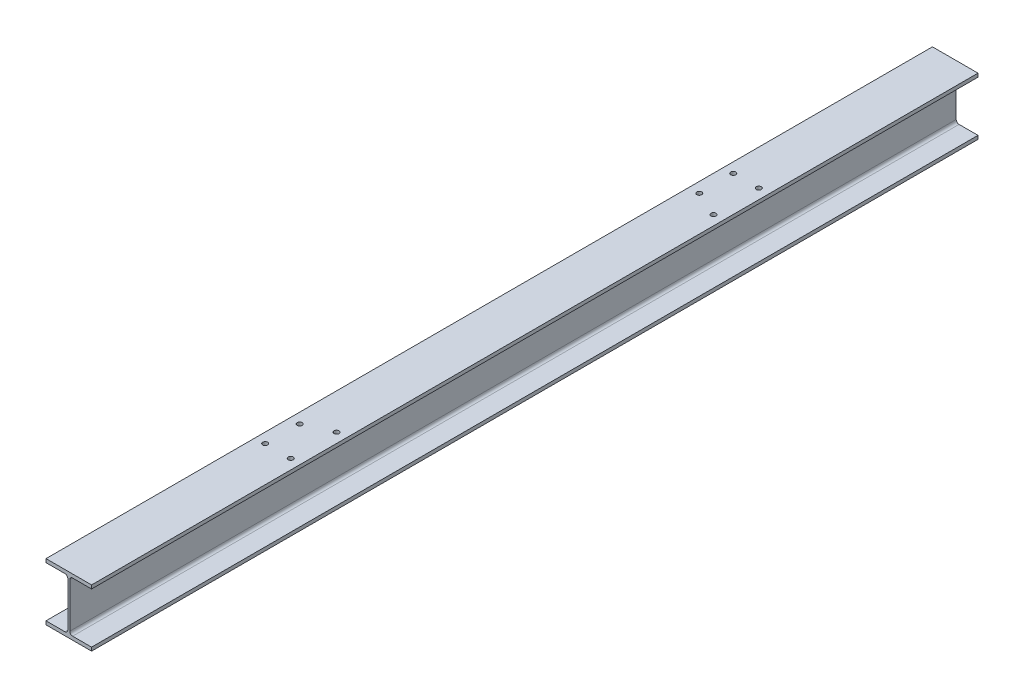
ISO-10303-21;
HEADER;
FILE_DESCRIPTION(('STEP AP214'),'2;1');
FILE_NAME('part.step','',(''),(''),'','','');
FILE_SCHEMA(('AUTOMOTIVE_DESIGN { 1 0 10303 214 1 1 1 1 }'));
ENDSEC;
DATA;
#1=APPLICATION_CONTEXT('core data for automotive mechanical design processes');
#2=APPLICATION_PROTOCOL_DEFINITION('international standard','automotive_design',2000,#1);
#3=PRODUCT_CONTEXT('',#1,'mechanical');
#4=PRODUCT('Part','Part','',(#3));
#5=PRODUCT_RELATED_PRODUCT_CATEGORY('part','',(#4));
#6=PRODUCT_DEFINITION_FORMATION('','',#4);
#7=PRODUCT_DEFINITION_CONTEXT('part definition',#1,'design');
#8=PRODUCT_DEFINITION('design','',#6,#7);
#9=PRODUCT_DEFINITION_SHAPE('','',#8);
#10=(LENGTH_UNIT() NAMED_UNIT(*) SI_UNIT(.MILLI.,.METRE.));
#11=(NAMED_UNIT(*) PLANE_ANGLE_UNIT() SI_UNIT($,.RADIAN.));
#12=(NAMED_UNIT(*) SI_UNIT($,.STERADIAN.) SOLID_ANGLE_UNIT());
#13=UNCERTAINTY_MEASURE_WITH_UNIT(LENGTH_MEASURE(1.E-05),#10,'distance_accuracy_value','');
#14=(GEOMETRIC_REPRESENTATION_CONTEXT(3) GLOBAL_UNCERTAINTY_ASSIGNED_CONTEXT((#13)) GLOBAL_UNIT_ASSIGNED_CONTEXT((#10,
#11,#12)) REPRESENTATION_CONTEXT('',''));
#15=CARTESIAN_POINT('',(0.,0.,0.));
#16=DIRECTION('',(0.,0.,1.));
#17=DIRECTION('',(1.,0.,0.));
#18=AXIS2_PLACEMENT_3D('',#15,#16,#17);
#19=CARTESIAN_POINT('',(183.500636302133,10.8236048524095,-1977.89024698075));
#20=DIRECTION('',(0.,-1.,0.));
#21=DIRECTION('',(0.,0.,-1.));
#22=AXIS2_PLACEMENT_3D('',#19,#20,#21);
#23=PLANE('',#22);
#24=DIRECTION('',(1.,0.,0.));
#25=VECTOR('',#24,1.);
#26=CARTESIAN_POINT('',(183.500636302133,10.8236048524095,1984.50975301925));
#27=LINE('',#26,#25);
#28=CARTESIAN_POINT('',(-20.207363697867,10.8236048524095,1984.50975301925));
#29=VERTEX_POINT('',#28);
#30=CARTESIAN_POINT('',(183.500636302133,10.8236048524095,1984.50975301925));
#31=VERTEX_POINT('',#30);
#32=EDGE_CURVE('E187',#29,#31,#27,.T.);
#33=ORIENTED_EDGE('',*,*,#32,.F.);
#34=DIRECTION('',(0.,0.,1.));
#35=VECTOR('',#34,1.);
#36=CARTESIAN_POINT('',(-20.207363697867,10.8236048524095,-1977.89024698075));
#37=LINE('',#36,#35);
#38=CARTESIAN_POINT('',(-20.207363697867,10.8236048524095,-1977.89024698075));
#39=VERTEX_POINT('',#38);
#40=EDGE_CURVE('E11',#39,#29,#37,.T.);
#41=ORIENTED_EDGE('',*,*,#40,.F.);
#42=DIRECTION('',(1.,0.,0.));
#43=VECTOR('',#42,1.);
#44=CARTESIAN_POINT('',(183.500636302133,10.8236048524095,-1977.89024698075));
#45=LINE('',#44,#43);
#46=CARTESIAN_POINT('',(183.500636302133,10.8236048524095,-1977.89024698075));
#47=VERTEX_POINT('',#46);
#48=EDGE_CURVE('E233',#39,#47,#45,.T.);
#49=ORIENTED_EDGE('',*,*,#48,.T.);
#50=DIRECTION('',(0.,0.,1.));
#51=VECTOR('',#50,1.);
#52=CARTESIAN_POINT('',(183.500636302133,10.8236048524095,-1977.89024698075));
#53=LINE('',#52,#51);
#54=EDGE_CURVE('E43',#47,#31,#53,.T.);
#55=ORIENTED_EDGE('',*,*,#54,.T.);
#56=EDGE_LOOP('',(#33,#41,#49,#55));
#57=FACE_BOUND('',#56,.T.);
#58=ADVANCED_FACE('F40',(#57),#23,.T.);
#59=CARTESIAN_POINT('',(-20.207363697867,10.8236048524095,-1977.89024698075));
#60=DIRECTION('',(-1.,0.,0.));
#61=DIRECTION('',(0.,-1.,0.));
#62=AXIS2_PLACEMENT_3D('',#59,#60,#61);
#63=PLANE('',#62);
#64=DIRECTION('',(0.,-1.,0.));
#65=VECTOR('',#64,1.);
#66=CARTESIAN_POINT('',(-20.207363697867,10.8236048524095,1984.50975301925));
#67=LINE('',#66,#65);
#68=CARTESIAN_POINT('',(-20.207363697867,26.5716048524095,1984.50975301925));
#69=VERTEX_POINT('',#68);
#70=EDGE_CURVE('E231',#69,#29,#67,.T.);
#71=ORIENTED_EDGE('',*,*,#70,.F.);
#72=DIRECTION('',(0.,0.,1.));
#73=VECTOR('',#72,1.);
#74=CARTESIAN_POINT('',(-20.207363697867,26.5716048524095,-1977.89024698075));
#75=LINE('',#74,#73);
#76=CARTESIAN_POINT('',(-20.207363697867,26.5716048524095,-1977.89024698075));
#77=VERTEX_POINT('',#76);
#78=EDGE_CURVE('E50',#77,#69,#75,.T.);
#79=ORIENTED_EDGE('',*,*,#78,.F.);
#80=DIRECTION('',(0.,-1.,0.));
#81=VECTOR('',#80,1.);
#82=CARTESIAN_POINT('',(-20.207363697867,10.8236048524095,-1977.89024698075));
#83=LINE('',#82,#81);
#84=EDGE_CURVE('E177',#77,#39,#83,.T.);
#85=ORIENTED_EDGE('',*,*,#84,.T.);
#86=ORIENTED_EDGE('',*,*,#40,.T.);
#87=EDGE_LOOP('',(#71,#79,#85,#86));
#88=FACE_BOUND('',#87,.T.);
#89=ADVANCED_FACE('F275',(#88),#63,.T.);
#90=CARTESIAN_POINT('',(-20.207363697867,26.5716048524095,-1977.89024698075));
#91=DIRECTION('',(0.,1.,0.));
#92=DIRECTION('',(-1.,0.,0.));
#93=AXIS2_PLACEMENT_3D('',#90,#91,#92);
#94=PLANE('',#93);
#95=DIRECTION('',(-1.,0.,0.));
#96=VECTOR('',#95,1.);
#97=CARTESIAN_POINT('',(-20.207363697867,26.5716048524095,1984.50975301925));
#98=LINE('',#97,#96);
#99=CARTESIAN_POINT('',(64.501636302133,26.5716048524095,1984.50975301925));
#100=VERTEX_POINT('',#99);
#101=EDGE_CURVE('E163',#100,#69,#98,.T.);
#102=ORIENTED_EDGE('',*,*,#101,.F.);
#103=DIRECTION('',(0.,0.,1.));
#104=VECTOR('',#103,1.);
#105=CARTESIAN_POINT('',(64.501636302133,26.5716048524095,-1977.89024698075));
#106=LINE('',#105,#104);
#107=CARTESIAN_POINT('',(64.501636302133,26.5716048524095,-1977.89024698075));
#108=VERTEX_POINT('',#107);
#109=EDGE_CURVE('E158',#108,#100,#106,.T.);
#110=ORIENTED_EDGE('',*,*,#109,.F.);
#111=DIRECTION('',(-1.,0.,0.));
#112=VECTOR('',#111,1.);
#113=CARTESIAN_POINT('',(-20.207363697867,26.5716048524095,-1977.89024698075));
#114=LINE('',#113,#112);
#115=EDGE_CURVE('E161',#108,#77,#114,.T.);
#116=ORIENTED_EDGE('',*,*,#115,.T.);
#117=ORIENTED_EDGE('',*,*,#78,.T.);
#118=EDGE_LOOP('',(#102,#110,#116,#117));
#119=FACE_BOUND('',#118,.T.);
#120=ADVANCED_FACE('F160',(#119),#94,.T.);
#121=CARTESIAN_POINT('',(64.501636302133,39.2716048524095,-1977.89024698075));
#122=DIRECTION('',(0.,0.,1.));
#123=DIRECTION('',(1.,0.,0.));
#124=AXIS2_PLACEMENT_3D('',#121,#122,#123);
#125=CYLINDRICAL_SURFACE('',#124,12.7);
#126=CARTESIAN_POINT('',(64.501636302133,39.2716048524095,1984.50975301925));
#127=DIRECTION('',(0.,0.,-1.));
#128=DIRECTION('',(1.,0.,0.));
#129=AXIS2_PLACEMENT_3D('',#126,#127,#128);
#130=CIRCLE('',#129,12.7);
#131=CARTESIAN_POINT('',(77.201636302133,39.2716048524095,1984.50975301925));
#132=VERTEX_POINT('',#131);
#133=EDGE_CURVE('E228',#132,#100,#130,.T.);
#134=ORIENTED_EDGE('',*,*,#133,.F.);
#135=DIRECTION('',(0.,0.,1.));
#136=VECTOR('',#135,1.);
#137=CARTESIAN_POINT('',(77.201636302133,39.2716048524095,-1977.89024698075));
#138=LINE('',#137,#136);
#139=CARTESIAN_POINT('',(77.201636302133,39.2716048524095,-1977.89024698075));
#140=VERTEX_POINT('',#139);
#141=EDGE_CURVE('E169',#140,#132,#138,.T.);
#142=ORIENTED_EDGE('',*,*,#141,.F.);
#143=CARTESIAN_POINT('',(64.501636302133,39.2716048524095,-1977.89024698075));
#144=DIRECTION('',(0.,0.,-1.));
#145=DIRECTION('',(1.,0.,0.));
#146=AXIS2_PLACEMENT_3D('',#143,#144,#145);
#147=CIRCLE('',#146,12.7);
#148=EDGE_CURVE('E175',#140,#108,#147,.T.);
#149=ORIENTED_EDGE('',*,*,#148,.T.);
#150=ORIENTED_EDGE('',*,*,#109,.T.);
#151=EDGE_LOOP('',(#134,#142,#149,#150));
#152=FACE_BOUND('',#151,.T.);
#153=ADVANCED_FACE('F179',(#152),#125,.F.);
#154=CARTESIAN_POINT('',(77.201636302133,39.2716048524095,-1977.89024698075));
#155=DIRECTION('',(-1.,0.,0.));
#156=DIRECTION('',(0.,-1.,0.));
#157=AXIS2_PLACEMENT_3D('',#154,#155,#156);
#158=PLANE('',#157);
#159=DIRECTION('',(0.,-1.,0.));
#160=VECTOR('',#159,1.);
#161=CARTESIAN_POINT('',(77.201636302133,39.2716048524095,1984.50975301925));
#162=LINE('',#161,#160);
#163=CARTESIAN_POINT('',(77.2016363021329,238.91560485241,1984.50975301925));
#164=VERTEX_POINT('',#163);
#165=EDGE_CURVE('E225',#164,#132,#162,.T.);
#166=ORIENTED_EDGE('',*,*,#165,.F.);
#167=DIRECTION('',(0.,0.,1.));
#168=VECTOR('',#167,1.);
#169=CARTESIAN_POINT('',(77.2016363021329,238.91560485241,-1977.89024698075));
#170=LINE('',#169,#168);
#171=CARTESIAN_POINT('',(77.2016363021329,238.91560485241,-1977.89024698075));
#172=VERTEX_POINT('',#171);
#173=EDGE_CURVE('E239',#172,#164,#170,.T.);
#174=ORIENTED_EDGE('',*,*,#173,.F.);
#175=DIRECTION('',(0.,-1.,0.));
#176=VECTOR('',#175,1.);
#177=CARTESIAN_POINT('',(77.201636302133,39.2716048524095,-1977.89024698075));
#178=LINE('',#177,#176);
#179=EDGE_CURVE('E180',#172,#140,#178,.T.);
#180=ORIENTED_EDGE('',*,*,#179,.T.);
#181=ORIENTED_EDGE('',*,*,#141,.T.);
#182=EDGE_LOOP('',(#166,#174,#180,#181));
#183=FACE_BOUND('',#182,.T.);
#184=ADVANCED_FACE('F288',(#183),#158,.T.);
#185=CARTESIAN_POINT('',(64.5016363021329,238.91560485241,-1977.89024698075));
#186=DIRECTION('',(0.,0.,1.));
#187=DIRECTION('',(1.,0.,0.));
#188=AXIS2_PLACEMENT_3D('',#185,#186,#187);
#189=CYLINDRICAL_SURFACE('',#188,12.7);
#190=CARTESIAN_POINT('',(64.5016363021329,238.91560485241,1984.50975301925));
#191=DIRECTION('',(0.,0.,-1.));
#192=DIRECTION('',(1.,0.,0.));
#193=AXIS2_PLACEMENT_3D('',#190,#191,#192);
#194=CIRCLE('',#193,12.7);
#195=CARTESIAN_POINT('',(64.5016363021329,251.61560485241,1984.50975301925));
#196=VERTEX_POINT('',#195);
#197=EDGE_CURVE('E222',#196,#164,#194,.T.);
#198=ORIENTED_EDGE('',*,*,#197,.F.);
#199=DIRECTION('',(0.,0.,1.));
#200=VECTOR('',#199,1.);
#201=CARTESIAN_POINT('',(64.5016363021329,251.61560485241,-1977.89024698075));
#202=LINE('',#201,#200);
#203=CARTESIAN_POINT('',(64.5016363021329,251.61560485241,-1977.89024698075));
#204=VERTEX_POINT('',#203);
#205=EDGE_CURVE('E242',#204,#196,#202,.T.);
#206=ORIENTED_EDGE('',*,*,#205,.F.);
#207=CARTESIAN_POINT('',(64.5016363021329,238.91560485241,-1977.89024698075));
#208=DIRECTION('',(0.,0.,-1.));
#209=DIRECTION('',(1.,0.,0.));
#210=AXIS2_PLACEMENT_3D('',#207,#208,#209);
#211=CIRCLE('',#210,12.7);
#212=EDGE_CURVE('E182',#204,#172,#211,.T.);
#213=ORIENTED_EDGE('',*,*,#212,.T.);
#214=ORIENTED_EDGE('',*,*,#173,.T.);
#215=EDGE_LOOP('',(#198,#206,#213,#214));
#216=FACE_BOUND('',#215,.T.);
#217=ADVANCED_FACE('F291',(#216),#189,.F.);
#218=CARTESIAN_POINT('',(64.5016363021329,251.61560485241,-1977.89024698075));
#219=DIRECTION('',(0.,-1.,0.));
#220=DIRECTION('',(0.,0.,-1.));
#221=AXIS2_PLACEMENT_3D('',#218,#219,#220);
#222=PLANE('',#221);
#223=CARTESIAN_POINT('',(24.4966363021329,251.61560485241,1049.4768369836));
#224=DIRECTION('',(0.,-1.,0.));
#225=DIRECTION('',(0.,0.,-1.));
#226=AXIS2_PLACEMENT_3D('',#223,#224,#225);
#227=CIRCLE('',#226,11.1124999999994);
#228=CARTESIAN_POINT('',(24.4966363021329,251.61560485241,1038.3643369836));
#229=VERTEX_POINT('',#228);
#230=EDGE_CURVE('E379',#229,#229,#227,.F.);
#231=ORIENTED_EDGE('',*,*,#230,.T.);
#232=EDGE_LOOP('',(#231));
#233=FACE_BOUND('',#232,.T.);
#234=CARTESIAN_POINT('',(25.7322612695542,251.61560485241,896.427245817367));
#235=DIRECTION('',(0.,-1.,0.));
#236=DIRECTION('',(0.,0.,-1.));
#237=AXIS2_PLACEMENT_3D('',#234,#235,#236);
#238=CIRCLE('',#237,11.1124999999994);
#239=CARTESIAN_POINT('',(25.7322612695542,251.61560485241,885.314745817368));
#240=VERTEX_POINT('',#239);
#241=EDGE_CURVE('E394',#240,#240,#238,.F.);
#242=ORIENTED_EDGE('',*,*,#241,.T.);
#243=EDGE_LOOP('',(#242));
#244=FACE_BOUND('',#243,.T.);
#245=CARTESIAN_POINT('',(25.7322612695542,251.61560485241,-889.807739778871));
#246=DIRECTION('',(0.,-1.,0.));
#247=DIRECTION('',(0.,0.,-1.));
#248=AXIS2_PLACEMENT_3D('',#245,#246,#247);
#249=CIRCLE('',#248,11.1124999999994);
#250=CARTESIAN_POINT('',(25.7322612695542,251.61560485241,-900.920239778871));
#251=VERTEX_POINT('',#250);
#252=EDGE_CURVE('E398',#251,#251,#249,.F.);
#253=ORIENTED_EDGE('',*,*,#252,.T.);
#254=EDGE_LOOP('',(#253));
#255=FACE_BOUND('',#254,.T.);
#256=CARTESIAN_POINT('',(24.4966363021329,251.61560485241,-1042.8573309451));
#257=DIRECTION('',(0.,-1.,0.));
#258=DIRECTION('',(0.,0.,-1.));
#259=AXIS2_PLACEMENT_3D('',#256,#257,#258);
#260=CIRCLE('',#259,11.1124999999994);
#261=CARTESIAN_POINT('',(24.4966363021329,251.61560485241,-1053.9698309451));
#262=VERTEX_POINT('',#261);
#263=EDGE_CURVE('E414',#262,#262,#260,.F.);
#264=ORIENTED_EDGE('',*,*,#263,.T.);
#265=EDGE_LOOP('',(#264));
#266=FACE_BOUND('',#265,.T.);
#267=DIRECTION('',(1.,0.,0.));
#268=VECTOR('',#267,1.);
#269=CARTESIAN_POINT('',(64.5016363021329,251.61560485241,1984.50975301925));
#270=LINE('',#269,#268);
#271=CARTESIAN_POINT('',(-20.2073636978671,251.61560485241,1984.50975301925));
#272=VERTEX_POINT('',#271);
#273=EDGE_CURVE('E219',#272,#196,#270,.T.);
#274=ORIENTED_EDGE('',*,*,#273,.F.);
#275=DIRECTION('',(0.,0.,1.));
#276=VECTOR('',#275,1.);
#277=CARTESIAN_POINT('',(-20.2073636978671,251.61560485241,-1977.89024698075));
#278=LINE('',#277,#276);
#279=CARTESIAN_POINT('',(-20.2073636978671,251.61560485241,-1977.89024698075));
#280=VERTEX_POINT('',#279);
#281=EDGE_CURVE('E245',#280,#272,#278,.T.);
#282=ORIENTED_EDGE('',*,*,#281,.F.);
#283=DIRECTION('',(1.,0.,0.));
#284=VECTOR('',#283,1.);
#285=CARTESIAN_POINT('',(64.5016363021329,251.61560485241,-1977.89024698075));
#286=LINE('',#285,#284);
#287=EDGE_CURVE('E454',#280,#204,#286,.T.);
#288=ORIENTED_EDGE('',*,*,#287,.T.);
#289=ORIENTED_EDGE('',*,*,#205,.T.);
#290=EDGE_LOOP('',(#274,#282,#288,#289));
#291=FACE_BOUND('',#290,.T.);
#292=ADVANCED_FACE('F295',(#233,#244,#255,#266,#291),#222,.T.);
#293=CARTESIAN_POINT('',(-20.2073636978671,251.61560485241,-1977.89024698075));
#294=DIRECTION('',(-1.,0.,0.));
#295=DIRECTION('',(0.,-1.,0.));
#296=AXIS2_PLACEMENT_3D('',#293,#294,#295);
#297=PLANE('',#296);
#298=DIRECTION('',(0.,-1.,0.));
#299=VECTOR('',#298,1.);
#300=CARTESIAN_POINT('',(-20.2073636978671,251.61560485241,1984.50975301925));
#301=LINE('',#300,#299);
#302=CARTESIAN_POINT('',(-20.2073636978671,267.363604852409,1984.50975301925));
#303=VERTEX_POINT('',#302);
#304=EDGE_CURVE('E216',#303,#272,#301,.T.);
#305=ORIENTED_EDGE('',*,*,#304,.F.);
#306=DIRECTION('',(0.,0.,1.));
#307=VECTOR('',#306,1.);
#308=CARTESIAN_POINT('',(-20.2073636978671,267.363604852409,-1977.89024698075));
#309=LINE('',#308,#307);
#310=CARTESIAN_POINT('',(-20.2073636978671,267.363604852409,-1977.89024698075));
#311=VERTEX_POINT('',#310);
#312=EDGE_CURVE('E248',#311,#303,#309,.T.);
#313=ORIENTED_EDGE('',*,*,#312,.F.);
#314=DIRECTION('',(0.,-1.,0.));
#315=VECTOR('',#314,1.);
#316=CARTESIAN_POINT('',(-20.2073636978671,251.61560485241,-1977.89024698075));
#317=LINE('',#316,#315);
#318=EDGE_CURVE('E451',#311,#280,#317,.T.);
#319=ORIENTED_EDGE('',*,*,#318,.T.);
#320=ORIENTED_EDGE('',*,*,#281,.T.);
#321=EDGE_LOOP('',(#305,#313,#319,#320));
#322=FACE_BOUND('',#321,.T.);
#323=ADVANCED_FACE('F299',(#322),#297,.T.);
#324=CARTESIAN_POINT('',(-20.2073636978671,267.363604852409,-1977.89024698075));
#325=DIRECTION('',(0.,1.,0.));
#326=DIRECTION('',(0.,0.,1.));
#327=AXIS2_PLACEMENT_3D('',#324,#325,#326);
#328=PLANE('',#327);
#329=CARTESIAN_POINT('',(138.796636302133,267.363604852409,1049.4768369836));
#330=DIRECTION('',(0.,1.,0.));
#331=DIRECTION('',(0.,0.,-1.));
#332=AXIS2_PLACEMENT_3D('',#329,#330,#331);
#333=CIRCLE('',#332,11.1124999999994);
#334=CARTESIAN_POINT('',(138.796636302133,267.363604852409,1038.3643369836));
#335=VERTEX_POINT('',#334);
#336=EDGE_CURVE('E378',#335,#335,#333,.T.);
#337=ORIENTED_EDGE('',*,*,#336,.F.);
#338=EDGE_LOOP('',(#337));
#339=FACE_BOUND('',#338,.T.);
#340=CARTESIAN_POINT('',(24.4966363021329,267.363604852409,1049.4768369836));
#341=DIRECTION('',(0.,1.,0.));
#342=DIRECTION('',(0.,0.,-1.));
#343=AXIS2_PLACEMENT_3D('',#340,#341,#342);
#344=CIRCLE('',#343,11.1124999999994);
#345=CARTESIAN_POINT('',(24.4966363021329,267.363604852409,1038.3643369836));
#346=VERTEX_POINT('',#345);
#347=EDGE_CURVE('E382',#346,#346,#344,.T.);
#348=ORIENTED_EDGE('',*,*,#347,.F.);
#349=EDGE_LOOP('',(#348));
#350=FACE_BOUND('',#349,.T.);
#351=CARTESIAN_POINT('',(140.032261269554,267.363604852409,845.627245817367));
#352=DIRECTION('',(0.,1.,0.));
#353=DIRECTION('',(0.,0.,-1.));
#354=AXIS2_PLACEMENT_3D('',#351,#352,#353);
#355=CIRCLE('',#354,11.1124999999994);
#356=CARTESIAN_POINT('',(140.032261269554,267.363604852409,834.514745817368));
#357=VERTEX_POINT('',#356);
#358=EDGE_CURVE('E391',#357,#357,#355,.T.);
#359=ORIENTED_EDGE('',*,*,#358,.F.);
#360=EDGE_LOOP('',(#359));
#361=FACE_BOUND('',#360,.T.);
#362=CARTESIAN_POINT('',(25.7322612695542,267.363604852409,896.427245817367));
#363=DIRECTION('',(0.,1.,0.));
#364=DIRECTION('',(0.,0.,-1.));
#365=AXIS2_PLACEMENT_3D('',#362,#363,#364);
#366=CIRCLE('',#365,11.1124999999994);
#367=CARTESIAN_POINT('',(25.7322612695542,267.363604852409,885.314745817368));
#368=VERTEX_POINT('',#367);
#369=EDGE_CURVE('E395',#368,#368,#366,.T.);
#370=ORIENTED_EDGE('',*,*,#369,.F.);
#371=EDGE_LOOP('',(#370));
#372=FACE_BOUND('',#371,.T.);
#373=CARTESIAN_POINT('',(25.7322612695542,267.363604852409,-889.807739778871));
#374=DIRECTION('',(0.,1.,0.));
#375=DIRECTION('',(0.,0.,1.));
#376=AXIS2_PLACEMENT_3D('',#373,#374,#375);
#377=CIRCLE('',#376,11.1124999999994);
#378=CARTESIAN_POINT('',(25.7322612695542,267.363604852409,-878.695239778872));
#379=VERTEX_POINT('',#378);
#380=EDGE_CURVE('E401',#379,#379,#377,.T.);
#381=ORIENTED_EDGE('',*,*,#380,.F.);
#382=EDGE_LOOP('',(#381));
#383=FACE_BOUND('',#382,.T.);
#384=CARTESIAN_POINT('',(140.032261269554,267.363604852409,-839.007739778872));
#385=DIRECTION('',(0.,1.,0.));
#386=DIRECTION('',(0.,0.,1.));
#387=AXIS2_PLACEMENT_3D('',#384,#385,#386);
#388=CIRCLE('',#387,11.1124999999994);
#389=CARTESIAN_POINT('',(140.032261269554,267.363604852409,-827.895239778872));
#390=VERTEX_POINT('',#389);
#391=EDGE_CURVE('E411',#390,#390,#388,.T.);
#392=ORIENTED_EDGE('',*,*,#391,.F.);
#393=EDGE_LOOP('',(#392));
#394=FACE_BOUND('',#393,.T.);
#395=CARTESIAN_POINT('',(24.4966363021329,267.363604852409,-1042.8573309451));
#396=DIRECTION('',(0.,1.,0.));
#397=DIRECTION('',(0.,0.,1.));
#398=AXIS2_PLACEMENT_3D('',#395,#396,#397);
#399=CIRCLE('',#398,11.1124999999994);
#400=CARTESIAN_POINT('',(24.4966363021329,267.363604852409,-1031.7448309451));
#401=VERTEX_POINT('',#400);
#402=EDGE_CURVE('E415',#401,#401,#399,.T.);
#403=ORIENTED_EDGE('',*,*,#402,.F.);
#404=EDGE_LOOP('',(#403));
#405=FACE_BOUND('',#404,.T.);
#406=CARTESIAN_POINT('',(138.796636302133,267.363604852409,-1042.8573309451));
#407=DIRECTION('',(0.,1.,0.));
#408=DIRECTION('',(0.,0.,1.));
#409=AXIS2_PLACEMENT_3D('',#406,#407,#408);
#410=CIRCLE('',#409,11.1124999999994);
#411=CARTESIAN_POINT('',(138.796636302133,267.363604852409,-1031.7448309451));
#412=VERTEX_POINT('',#411);
#413=EDGE_CURVE('E192',#412,#412,#410,.T.);
#414=ORIENTED_EDGE('',*,*,#413,.F.);
#415=EDGE_LOOP('',(#414));
#416=FACE_BOUND('',#415,.T.);
#417=DIRECTION('',(-1.,0.,0.));
#418=VECTOR('',#417,1.);
#419=CARTESIAN_POINT('',(-20.2073636978671,267.363604852409,1984.50975301925));
#420=LINE('',#419,#418);
#421=CARTESIAN_POINT('',(183.500636302133,267.363604852409,1984.50975301925));
#422=VERTEX_POINT('',#421);
#423=EDGE_CURVE('E213',#422,#303,#420,.T.);
#424=ORIENTED_EDGE('',*,*,#423,.F.);
#425=DIRECTION('',(0.,0.,1.));
#426=VECTOR('',#425,1.);
#427=CARTESIAN_POINT('',(183.500636302133,267.363604852409,-1977.89024698075));
#428=LINE('',#427,#426);
#429=CARTESIAN_POINT('',(183.500636302133,267.363604852409,-1977.89024698075));
#430=VERTEX_POINT('',#429);
#431=EDGE_CURVE('E251',#430,#422,#428,.T.);
#432=ORIENTED_EDGE('',*,*,#431,.F.);
#433=DIRECTION('',(-1.,0.,0.));
#434=VECTOR('',#433,1.);
#435=CARTESIAN_POINT('',(-20.2073636978671,267.363604852409,-1977.89024698075));
#436=LINE('',#435,#434);
#437=EDGE_CURVE('E448',#430,#311,#436,.T.);
#438=ORIENTED_EDGE('',*,*,#437,.T.);
#439=ORIENTED_EDGE('',*,*,#312,.T.);
#440=EDGE_LOOP('',(#424,#432,#438,#439));
#441=FACE_BOUND('',#440,.T.);
#442=ADVANCED_FACE('F303',(#339,#350,#361,#372,#383,#394,#405,#416,#441),#328,.T.);
#443=CARTESIAN_POINT('',(183.500636302133,267.363604852409,-1977.89024698075));
#444=DIRECTION('',(1.,0.,0.));
#445=DIRECTION('',(0.,1.,0.));
#446=AXIS2_PLACEMENT_3D('',#443,#444,#445);
#447=PLANE('',#446);
#448=DIRECTION('',(0.,1.,0.));
#449=VECTOR('',#448,1.);
#450=CARTESIAN_POINT('',(183.500636302133,267.363604852409,1984.50975301925));
#451=LINE('',#450,#449);
#452=CARTESIAN_POINT('',(183.500636302133,251.61560485241,1984.50975301925));
#453=VERTEX_POINT('',#452);
#454=EDGE_CURVE('E210',#453,#422,#451,.T.);
#455=ORIENTED_EDGE('',*,*,#454,.F.);
#456=DIRECTION('',(0.,0.,1.));
#457=VECTOR('',#456,1.);
#458=CARTESIAN_POINT('',(183.500636302133,251.61560485241,-1977.89024698075));
#459=LINE('',#458,#457);
#460=CARTESIAN_POINT('',(183.500636302133,251.61560485241,-1977.89024698075));
#461=VERTEX_POINT('',#460);
#462=EDGE_CURVE('E254',#461,#453,#459,.T.);
#463=ORIENTED_EDGE('',*,*,#462,.F.);
#464=DIRECTION('',(0.,1.,0.));
#465=VECTOR('',#464,1.);
#466=CARTESIAN_POINT('',(183.500636302133,267.363604852409,-1977.89024698075));
#467=LINE('',#466,#465);
#468=EDGE_CURVE('E445',#461,#430,#467,.T.);
#469=ORIENTED_EDGE('',*,*,#468,.T.);
#470=ORIENTED_EDGE('',*,*,#431,.T.);
#471=EDGE_LOOP('',(#455,#463,#469,#470));
#472=FACE_BOUND('',#471,.T.);
#473=ADVANCED_FACE('F307',(#472),#447,.T.);
#474=CARTESIAN_POINT('',(183.500636302133,251.61560485241,-1977.89024698075));
#475=DIRECTION('',(0.,-1.,0.));
#476=DIRECTION('',(0.,0.,-1.));
#477=AXIS2_PLACEMENT_3D('',#474,#475,#476);
#478=PLANE('',#477);
#479=CARTESIAN_POINT('',(138.796636302133,251.61560485241,1049.4768369836));
#480=DIRECTION('',(0.,-1.,0.));
#481=DIRECTION('',(0.,0.,-1.));
#482=AXIS2_PLACEMENT_3D('',#479,#480,#481);
#483=CIRCLE('',#482,11.1124999999994);
#484=CARTESIAN_POINT('',(138.796636302133,251.61560485241,1038.3643369836));
#485=VERTEX_POINT('',#484);
#486=EDGE_CURVE('E375',#485,#485,#483,.F.);
#487=ORIENTED_EDGE('',*,*,#486,.T.);
#488=EDGE_LOOP('',(#487));
#489=FACE_BOUND('',#488,.T.);
#490=CARTESIAN_POINT('',(140.032261269554,251.61560485241,845.627245817367));
#491=DIRECTION('',(0.,-1.,0.));
#492=DIRECTION('',(0.,0.,-1.));
#493=AXIS2_PLACEMENT_3D('',#490,#491,#492);
#494=CIRCLE('',#493,11.1124999999994);
#495=CARTESIAN_POINT('',(140.032261269554,251.61560485241,834.514745817368));
#496=VERTEX_POINT('',#495);
#497=EDGE_CURVE('E387',#496,#496,#494,.F.);
#498=ORIENTED_EDGE('',*,*,#497,.T.);
#499=EDGE_LOOP('',(#498));
#500=FACE_BOUND('',#499,.T.);
#501=CARTESIAN_POINT('',(140.032261269554,251.61560485241,-839.007739778872));
#502=DIRECTION('',(0.,-1.,0.));
#503=DIRECTION('',(0.,0.,-1.));
#504=AXIS2_PLACEMENT_3D('',#501,#502,#503);
#505=CIRCLE('',#504,11.1124999999994);
#506=CARTESIAN_POINT('',(140.032261269554,251.61560485241,-850.120239778871));
#507=VERTEX_POINT('',#506);
#508=EDGE_CURVE('E405',#507,#507,#505,.F.);
#509=ORIENTED_EDGE('',*,*,#508,.T.);
#510=EDGE_LOOP('',(#509));
#511=FACE_BOUND('',#510,.T.);
#512=CARTESIAN_POINT('',(138.796636302133,251.61560485241,-1042.8573309451));
#513=DIRECTION('',(0.,-1.,0.));
#514=DIRECTION('',(0.,0.,-1.));
#515=AXIS2_PLACEMENT_3D('',#512,#513,#514);
#516=CIRCLE('',#515,11.1124999999994);
#517=CARTESIAN_POINT('',(138.796636302133,251.61560485241,-1053.9698309451));
#518=VERTEX_POINT('',#517);
#519=EDGE_CURVE('E418',#518,#518,#516,.F.);
#520=ORIENTED_EDGE('',*,*,#519,.T.);
#521=EDGE_LOOP('',(#520));
#522=FACE_BOUND('',#521,.T.);
#523=DIRECTION('',(1.,0.,0.));
#524=VECTOR('',#523,1.);
#525=CARTESIAN_POINT('',(183.500636302133,251.61560485241,1984.50975301925));
#526=LINE('',#525,#524);
#527=CARTESIAN_POINT('',(98.7916363021329,251.61560485241,1984.50975301925));
#528=VERTEX_POINT('',#527);
#529=EDGE_CURVE('E207',#528,#453,#526,.T.);
#530=ORIENTED_EDGE('',*,*,#529,.F.);
#531=DIRECTION('',(0.,0.,1.));
#532=VECTOR('',#531,1.);
#533=CARTESIAN_POINT('',(98.7916363021329,251.61560485241,-1977.89024698075));
#534=LINE('',#533,#532);
#535=CARTESIAN_POINT('',(98.7916363021329,251.61560485241,-1977.89024698075));
#536=VERTEX_POINT('',#535);
#537=EDGE_CURVE('E257',#536,#528,#534,.T.);
#538=ORIENTED_EDGE('',*,*,#537,.F.);
#539=DIRECTION('',(1.,0.,0.));
#540=VECTOR('',#539,1.);
#541=CARTESIAN_POINT('',(183.500636302133,251.61560485241,-1977.89024698075));
#542=LINE('',#541,#540);
#543=EDGE_CURVE('E442',#536,#461,#542,.T.);
#544=ORIENTED_EDGE('',*,*,#543,.T.);
#545=ORIENTED_EDGE('',*,*,#462,.T.);
#546=EDGE_LOOP('',(#530,#538,#544,#545));
#547=FACE_BOUND('',#546,.T.);
#548=ADVANCED_FACE('F311',(#489,#500,#511,#522,#547),#478,.T.);
#549=CARTESIAN_POINT('',(98.7916363021329,238.91560485241,-1977.89024698075));
#550=DIRECTION('',(0.,0.,1.));
#551=DIRECTION('',(1.,0.,0.));
#552=AXIS2_PLACEMENT_3D('',#549,#550,#551);
#553=CYLINDRICAL_SURFACE('',#552,12.7);
#554=CARTESIAN_POINT('',(98.7916363021329,238.91560485241,1984.50975301925));
#555=DIRECTION('',(0.,0.,-1.));
#556=DIRECTION('',(1.,0.,0.));
#557=AXIS2_PLACEMENT_3D('',#554,#555,#556);
#558=CIRCLE('',#557,12.7);
#559=CARTESIAN_POINT('',(86.091636302133,238.91560485241,1984.50975301925));
#560=VERTEX_POINT('',#559);
#561=EDGE_CURVE('E204',#560,#528,#558,.T.);
#562=ORIENTED_EDGE('',*,*,#561,.F.);
#563=DIRECTION('',(0.,0.,1.));
#564=VECTOR('',#563,1.);
#565=CARTESIAN_POINT('',(86.091636302133,238.91560485241,-1977.89024698075));
#566=LINE('',#565,#564);
#567=CARTESIAN_POINT('',(86.091636302133,238.91560485241,-1977.89024698075));
#568=VERTEX_POINT('',#567);
#569=EDGE_CURVE('E260',#568,#560,#566,.T.);
#570=ORIENTED_EDGE('',*,*,#569,.F.);
#571=CARTESIAN_POINT('',(98.7916363021329,238.91560485241,-1977.89024698075));
#572=DIRECTION('',(0.,0.,-1.));
#573=DIRECTION('',(1.,0.,0.));
#574=AXIS2_PLACEMENT_3D('',#571,#572,#573);
#575=CIRCLE('',#574,12.7);
#576=EDGE_CURVE('E439',#568,#536,#575,.T.);
#577=ORIENTED_EDGE('',*,*,#576,.T.);
#578=ORIENTED_EDGE('',*,*,#537,.T.);
#579=EDGE_LOOP('',(#562,#570,#577,#578));
#580=FACE_BOUND('',#579,.T.);
#581=ADVANCED_FACE('F315',(#580),#553,.F.);
#582=CARTESIAN_POINT('',(86.0916363021329,238.91560485241,-1977.89024698075));
#583=DIRECTION('',(1.,0.,0.));
#584=DIRECTION('',(0.,1.,0.));
#585=AXIS2_PLACEMENT_3D('',#582,#583,#584);
#586=PLANE('',#585);
#587=DIRECTION('',(0.,1.,0.));
#588=VECTOR('',#587,1.);
#589=CARTESIAN_POINT('',(86.0916363021329,238.91560485241,1984.50975301925));
#590=LINE('',#589,#588);
#591=CARTESIAN_POINT('',(86.091636302133,39.2716048524095,1984.50975301925));
#592=VERTEX_POINT('',#591);
#593=EDGE_CURVE('E201',#592,#560,#590,.T.);
#594=ORIENTED_EDGE('',*,*,#593,.F.);
#595=DIRECTION('',(0.,0.,1.));
#596=VECTOR('',#595,1.);
#597=CARTESIAN_POINT('',(86.091636302133,39.2716048524095,-1977.89024698075));
#598=LINE('',#597,#596);
#599=CARTESIAN_POINT('',(86.091636302133,39.2716048524095,-1977.89024698075));
#600=VERTEX_POINT('',#599);
#601=EDGE_CURVE('E263',#600,#592,#598,.T.);
#602=ORIENTED_EDGE('',*,*,#601,.F.);
#603=DIRECTION('',(0.,1.,0.));
#604=VECTOR('',#603,1.);
#605=CARTESIAN_POINT('',(86.0916363021329,238.91560485241,-1977.89024698075));
#606=LINE('',#605,#604);
#607=EDGE_CURVE('E436',#600,#568,#606,.T.);
#608=ORIENTED_EDGE('',*,*,#607,.T.);
#609=ORIENTED_EDGE('',*,*,#569,.T.);
#610=EDGE_LOOP('',(#594,#602,#608,#609));
#611=FACE_BOUND('',#610,.T.);
#612=ADVANCED_FACE('F319',(#611),#586,.T.);
#613=CARTESIAN_POINT('',(98.7916363021329,39.2716048524095,-1977.89024698075));
#614=DIRECTION('',(0.,0.,1.));
#615=DIRECTION('',(1.,0.,0.));
#616=AXIS2_PLACEMENT_3D('',#613,#614,#615);
#617=CYLINDRICAL_SURFACE('',#616,12.7);
#618=CARTESIAN_POINT('',(98.7916363021329,39.2716048524095,1984.50975301925));
#619=DIRECTION('',(0.,0.,-1.));
#620=DIRECTION('',(1.,0.,0.));
#621=AXIS2_PLACEMENT_3D('',#618,#619,#620);
#622=CIRCLE('',#621,12.7);
#623=CARTESIAN_POINT('',(98.7916363021329,26.5716048524095,1984.50975301925));
#624=VERTEX_POINT('',#623);
#625=EDGE_CURVE('E198',#624,#592,#622,.T.);
#626=ORIENTED_EDGE('',*,*,#625,.F.);
#627=DIRECTION('',(0.,0.,1.));
#628=VECTOR('',#627,1.);
#629=CARTESIAN_POINT('',(98.7916363021329,26.5716048524095,-1977.89024698075));
#630=LINE('',#629,#628);
#631=CARTESIAN_POINT('',(98.7916363021329,26.5716048524095,-1977.89024698075));
#632=VERTEX_POINT('',#631);
#633=EDGE_CURVE('E266',#632,#624,#630,.T.);
#634=ORIENTED_EDGE('',*,*,#633,.F.);
#635=CARTESIAN_POINT('',(98.7916363021329,39.2716048524095,-1977.89024698075));
#636=DIRECTION('',(0.,0.,-1.));
#637=DIRECTION('',(1.,0.,0.));
#638=AXIS2_PLACEMENT_3D('',#635,#636,#637);
#639=CIRCLE('',#638,12.7);
#640=EDGE_CURVE('E433',#632,#600,#639,.T.);
#641=ORIENTED_EDGE('',*,*,#640,.T.);
#642=ORIENTED_EDGE('',*,*,#601,.T.);
#643=EDGE_LOOP('',(#626,#634,#641,#642));
#644=FACE_BOUND('',#643,.T.);
#645=ADVANCED_FACE('F323',(#644),#617,.F.);
#646=CARTESIAN_POINT('',(98.7916363021329,26.5716048524095,-1977.89024698075));
#647=DIRECTION('',(0.,1.,0.));
#648=DIRECTION('',(-1.,0.,0.));
#649=AXIS2_PLACEMENT_3D('',#646,#647,#648);
#650=PLANE('',#649);
#651=DIRECTION('',(-1.,0.,0.));
#652=VECTOR('',#651,1.);
#653=CARTESIAN_POINT('',(98.7916363021329,26.5716048524095,1984.50975301925));
#654=LINE('',#653,#652);
#655=CARTESIAN_POINT('',(183.500636302133,26.5716048524095,1984.50975301925));
#656=VERTEX_POINT('',#655);
#657=EDGE_CURVE('E195',#656,#624,#654,.T.);
#658=ORIENTED_EDGE('',*,*,#657,.F.);
#659=DIRECTION('',(0.,0.,1.));
#660=VECTOR('',#659,1.);
#661=CARTESIAN_POINT('',(183.500636302133,26.5716048524095,-1977.89024698075));
#662=LINE('',#661,#660);
#663=CARTESIAN_POINT('',(183.500636302133,26.5716048524095,-1977.89024698075));
#664=VERTEX_POINT('',#663);
#665=EDGE_CURVE('E268',#664,#656,#662,.T.);
#666=ORIENTED_EDGE('',*,*,#665,.F.);
#667=DIRECTION('',(-1.,0.,0.));
#668=VECTOR('',#667,1.);
#669=CARTESIAN_POINT('',(98.7916363021329,26.5716048524095,-1977.89024698075));
#670=LINE('',#669,#668);
#671=EDGE_CURVE('E430',#664,#632,#670,.T.);
#672=ORIENTED_EDGE('',*,*,#671,.T.);
#673=ORIENTED_EDGE('',*,*,#633,.T.);
#674=EDGE_LOOP('',(#658,#666,#672,#673));
#675=FACE_BOUND('',#674,.T.);
#676=ADVANCED_FACE('F327',(#675),#650,.T.);
#677=CARTESIAN_POINT('',(183.500636302133,26.5716048524095,-1977.89024698075));
#678=DIRECTION('',(1.,0.,0.));
#679=DIRECTION('',(0.,0.,-1.));
#680=AXIS2_PLACEMENT_3D('',#677,#678,#679);
#681=PLANE('',#680);
#682=DIRECTION('',(0.,1.,0.));
#683=VECTOR('',#682,1.);
#684=CARTESIAN_POINT('',(183.500636302133,26.5716048524095,1984.50975301925));
#685=LINE('',#684,#683);
#686=EDGE_CURVE('E191',#31,#656,#685,.T.);
#687=ORIENTED_EDGE('',*,*,#686,.F.);
#688=ORIENTED_EDGE('',*,*,#54,.F.);
#689=DIRECTION('',(0.,1.,0.));
#690=VECTOR('',#689,1.);
#691=CARTESIAN_POINT('',(183.500636302133,26.5716048524095,-1977.89024698075));
#692=LINE('',#691,#690);
#693=EDGE_CURVE('E428',#47,#664,#692,.T.);
#694=ORIENTED_EDGE('',*,*,#693,.T.);
#695=ORIENTED_EDGE('',*,*,#665,.T.);
#696=EDGE_LOOP('',(#687,#688,#694,#695));
#697=FACE_BOUND('',#696,.T.);
#698=ADVANCED_FACE('F272',(#697),#681,.T.);
#699=CARTESIAN_POINT('',(64.501636302133,39.2716048524095,-1977.89024698075));
#700=DIRECTION('',(0.,0.,1.));
#701=DIRECTION('',(1.,0.,0.));
#702=AXIS2_PLACEMENT_3D('',#699,#700,#701);
#703=PLANE('',#702);
#704=ORIENTED_EDGE('',*,*,#48,.F.);
#705=ORIENTED_EDGE('',*,*,#84,.F.);
#706=ORIENTED_EDGE('',*,*,#115,.F.);
#707=ORIENTED_EDGE('',*,*,#148,.F.);
#708=ORIENTED_EDGE('',*,*,#179,.F.);
#709=ORIENTED_EDGE('',*,*,#212,.F.);
#710=ORIENTED_EDGE('',*,*,#287,.F.);
#711=ORIENTED_EDGE('',*,*,#318,.F.);
#712=ORIENTED_EDGE('',*,*,#437,.F.);
#713=ORIENTED_EDGE('',*,*,#468,.F.);
#714=ORIENTED_EDGE('',*,*,#543,.F.);
#715=ORIENTED_EDGE('',*,*,#576,.F.);
#716=ORIENTED_EDGE('',*,*,#607,.F.);
#717=ORIENTED_EDGE('',*,*,#640,.F.);
#718=ORIENTED_EDGE('',*,*,#671,.F.);
#719=ORIENTED_EDGE('',*,*,#693,.F.);
#720=EDGE_LOOP('',(#704,#705,#706,#707,#708,#709,#710,#711,#712,#713,#714,#715,#716,#717,#718,#719));
#721=FACE_BOUND('',#720,.T.);
#722=ADVANCED_FACE('F173',(#721),#703,.F.);
#723=CARTESIAN_POINT('',(64.501636302133,39.2716048524095,1984.50975301925));
#724=DIRECTION('',(0.,0.,1.));
#725=DIRECTION('',(1.,0.,0.));
#726=AXIS2_PLACEMENT_3D('',#723,#724,#725);
#727=PLANE('',#726);
#728=ORIENTED_EDGE('',*,*,#32,.T.);
#729=ORIENTED_EDGE('',*,*,#686,.T.);
#730=ORIENTED_EDGE('',*,*,#657,.T.);
#731=ORIENTED_EDGE('',*,*,#625,.T.);
#732=ORIENTED_EDGE('',*,*,#593,.T.);
#733=ORIENTED_EDGE('',*,*,#561,.T.);
#734=ORIENTED_EDGE('',*,*,#529,.T.);
#735=ORIENTED_EDGE('',*,*,#454,.T.);
#736=ORIENTED_EDGE('',*,*,#423,.T.);
#737=ORIENTED_EDGE('',*,*,#304,.T.);
#738=ORIENTED_EDGE('',*,*,#273,.T.);
#739=ORIENTED_EDGE('',*,*,#197,.T.);
#740=ORIENTED_EDGE('',*,*,#165,.T.);
#741=ORIENTED_EDGE('',*,*,#133,.T.);
#742=ORIENTED_EDGE('',*,*,#101,.T.);
#743=ORIENTED_EDGE('',*,*,#70,.T.);
#744=EDGE_LOOP('',(#728,#729,#730,#731,#732,#733,#734,#735,#736,#737,#738,#739,#740,#741,#742,#743));
#745=FACE_BOUND('',#744,.T.);
#746=ADVANCED_FACE('F274',(#745),#727,.T.);
#747=CARTESIAN_POINT('',(138.796636302133,10.8226048524095,-1042.8573309451));
#748=DIRECTION('',(0.,1.,0.));
#749=DIRECTION('',(0.,0.,1.));
#750=AXIS2_PLACEMENT_3D('',#747,#748,#749);
#751=CYLINDRICAL_SURFACE('',#750,11.1124999999994);
#752=ORIENTED_EDGE('',*,*,#519,.F.);
#753=EDGE_LOOP('',(#752));
#754=FACE_BOUND('',#753,.T.);
#755=ORIENTED_EDGE('',*,*,#413,.T.);
#756=EDGE_LOOP('',(#755));
#757=FACE_BOUND('',#756,.T.);
#758=ADVANCED_FACE('F338',(#754,#757),#751,.F.);
#759=CARTESIAN_POINT('',(24.4966363021329,10.8226048524095,-1042.8573309451));
#760=DIRECTION('',(0.,1.,0.));
#761=DIRECTION('',(0.,0.,1.));
#762=AXIS2_PLACEMENT_3D('',#759,#760,#761);
#763=CYLINDRICAL_SURFACE('',#762,11.1124999999994);
#764=ORIENTED_EDGE('',*,*,#263,.F.);
#765=EDGE_LOOP('',(#764));
#766=FACE_BOUND('',#765,.T.);
#767=ORIENTED_EDGE('',*,*,#402,.T.);
#768=EDGE_LOOP('',(#767));
#769=FACE_BOUND('',#768,.T.);
#770=ADVANCED_FACE('F342',(#766,#769),#763,.F.);
#771=CARTESIAN_POINT('',(140.032261269554,10.8226048524095,-839.007739778872));
#772=DIRECTION('',(0.,1.,0.));
#773=DIRECTION('',(0.,0.,1.));
#774=AXIS2_PLACEMENT_3D('',#771,#772,#773);
#775=CYLINDRICAL_SURFACE('',#774,11.1124999999994);
#776=ORIENTED_EDGE('',*,*,#508,.F.);
#777=EDGE_LOOP('',(#776));
#778=FACE_BOUND('',#777,.T.);
#779=ORIENTED_EDGE('',*,*,#391,.T.);
#780=EDGE_LOOP('',(#779));
#781=FACE_BOUND('',#780,.T.);
#782=ADVANCED_FACE('F346',(#778,#781),#775,.F.);
#783=CARTESIAN_POINT('',(25.7322612695542,10.8226048524095,-889.807739778871));
#784=DIRECTION('',(0.,1.,0.));
#785=DIRECTION('',(0.,0.,1.));
#786=AXIS2_PLACEMENT_3D('',#783,#784,#785);
#787=CYLINDRICAL_SURFACE('',#786,11.1124999999994);
#788=ORIENTED_EDGE('',*,*,#252,.F.);
#789=EDGE_LOOP('',(#788));
#790=FACE_BOUND('',#789,.T.);
#791=ORIENTED_EDGE('',*,*,#380,.T.);
#792=EDGE_LOOP('',(#791));
#793=FACE_BOUND('',#792,.T.);
#794=ADVANCED_FACE('F350',(#790,#793),#787,.F.);
#795=CARTESIAN_POINT('',(25.7322612695542,10.8226048524095,896.427245817367));
#796=DIRECTION('',(0.,1.,0.));
#797=DIRECTION('',(0.,0.,1.));
#798=AXIS2_PLACEMENT_3D('',#795,#796,#797);
#799=CYLINDRICAL_SURFACE('',#798,11.1124999999994);
#800=ORIENTED_EDGE('',*,*,#241,.F.);
#801=EDGE_LOOP('',(#800));
#802=FACE_BOUND('',#801,.T.);
#803=ORIENTED_EDGE('',*,*,#369,.T.);
#804=EDGE_LOOP('',(#803));
#805=FACE_BOUND('',#804,.T.);
#806=ADVANCED_FACE('F354',(#802,#805),#799,.F.);
#807=CARTESIAN_POINT('',(140.032261269554,10.8226048524095,845.627245817367));
#808=DIRECTION('',(0.,1.,0.));
#809=DIRECTION('',(0.,0.,1.));
#810=AXIS2_PLACEMENT_3D('',#807,#808,#809);
#811=CYLINDRICAL_SURFACE('',#810,11.1124999999994);
#812=ORIENTED_EDGE('',*,*,#497,.F.);
#813=EDGE_LOOP('',(#812));
#814=FACE_BOUND('',#813,.T.);
#815=ORIENTED_EDGE('',*,*,#358,.T.);
#816=EDGE_LOOP('',(#815));
#817=FACE_BOUND('',#816,.T.);
#818=ADVANCED_FACE('F358',(#814,#817),#811,.F.);
#819=CARTESIAN_POINT('',(24.4966363021329,10.8226048524095,1049.4768369836));
#820=DIRECTION('',(0.,1.,0.));
#821=DIRECTION('',(0.,0.,1.));
#822=AXIS2_PLACEMENT_3D('',#819,#820,#821);
#823=CYLINDRICAL_SURFACE('',#822,11.1124999999994);
#824=ORIENTED_EDGE('',*,*,#230,.F.);
#825=EDGE_LOOP('',(#824));
#826=FACE_BOUND('',#825,.T.);
#827=ORIENTED_EDGE('',*,*,#347,.T.);
#828=EDGE_LOOP('',(#827));
#829=FACE_BOUND('',#828,.T.);
#830=ADVANCED_FACE('F362',(#826,#829),#823,.F.);
#831=CARTESIAN_POINT('',(138.796636302133,10.8226048524095,1049.4768369836));
#832=DIRECTION('',(0.,1.,0.));
#833=DIRECTION('',(0.,0.,1.));
#834=AXIS2_PLACEMENT_3D('',#831,#832,#833);
#835=CYLINDRICAL_SURFACE('',#834,11.1124999999994);
#836=ORIENTED_EDGE('',*,*,#486,.F.);
#837=EDGE_LOOP('',(#836));
#838=FACE_BOUND('',#837,.T.);
#839=ORIENTED_EDGE('',*,*,#336,.T.);
#840=EDGE_LOOP('',(#839));
#841=FACE_BOUND('',#840,.T.);
#842=ADVANCED_FACE('F366',(#838,#841),#835,.F.);
#843=CLOSED_SHELL('',(#58,#89,#120,#153,#184,#217,#292,#323,#442,#473,#548,#581,#612,#645,#676,
#698,#722,#746,#758,#770,#782,#794,#806,#818,#830,#842));
#844=MANIFOLD_SOLID_BREP('B2',#843);
#845=ADVANCED_BREP_SHAPE_REPRESENTATION('',(#18,#844),#14);
#846=SHAPE_DEFINITION_REPRESENTATION(#9,#845);
ENDSEC;
END-ISO-10303-21;
